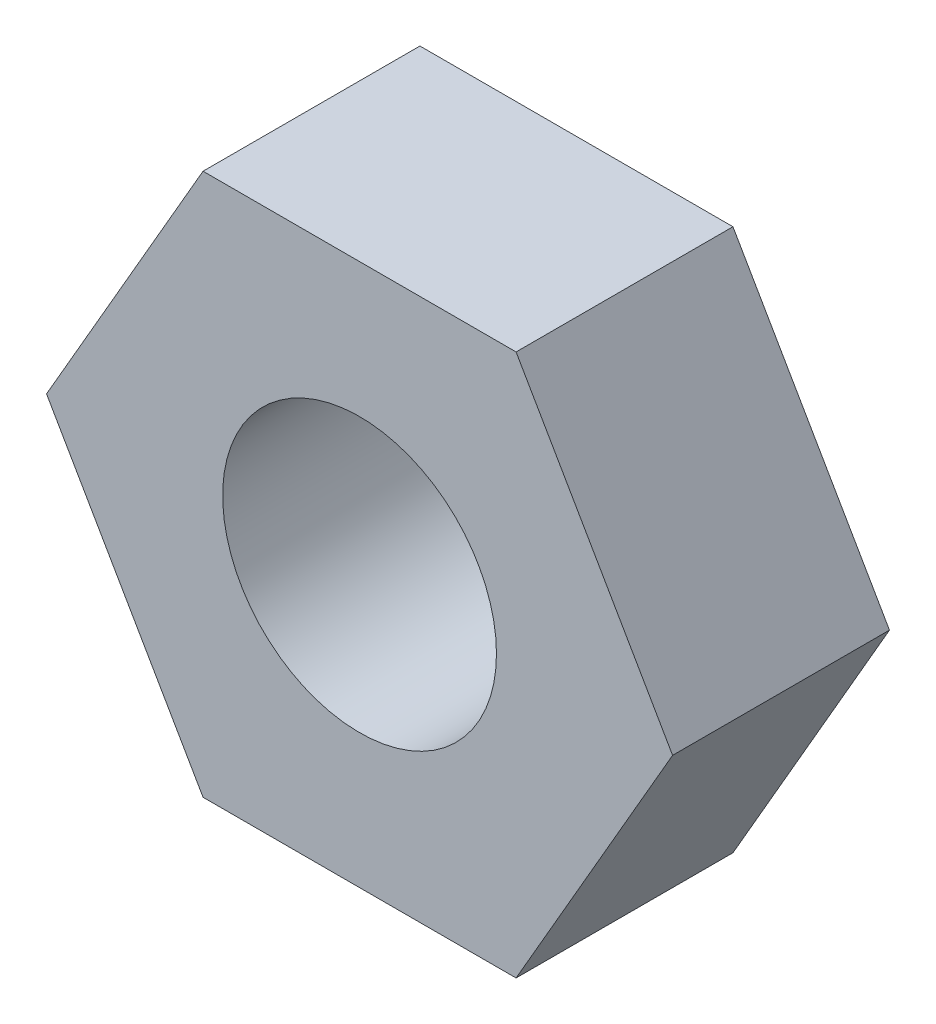
ISO-10303-21;
HEADER;
FILE_DESCRIPTION(('STEP AP214'),'2;1');
FILE_NAME('part.step','',(''),(''),'','','');
FILE_SCHEMA(('AUTOMOTIVE_DESIGN { 1 0 10303 214 1 1 1 1 }'));
ENDSEC;
DATA;
#1=APPLICATION_CONTEXT('core data for automotive mechanical design processes');
#2=APPLICATION_PROTOCOL_DEFINITION('international standard','automotive_design',2000,#1);
#3=PRODUCT_CONTEXT('',#1,'mechanical');
#4=PRODUCT('Part','Part','',(#3));
#5=PRODUCT_RELATED_PRODUCT_CATEGORY('part','',(#4));
#6=PRODUCT_DEFINITION_FORMATION('','',#4);
#7=PRODUCT_DEFINITION_CONTEXT('part definition',#1,'design');
#8=PRODUCT_DEFINITION('design','',#6,#7);
#9=PRODUCT_DEFINITION_SHAPE('','',#8);
#10=(LENGTH_UNIT() NAMED_UNIT(*) SI_UNIT(.MILLI.,.METRE.));
#11=(NAMED_UNIT(*) PLANE_ANGLE_UNIT() SI_UNIT($,.RADIAN.));
#12=(NAMED_UNIT(*) SI_UNIT($,.STERADIAN.) SOLID_ANGLE_UNIT());
#13=UNCERTAINTY_MEASURE_WITH_UNIT(LENGTH_MEASURE(1.E-05),#10,'distance_accuracy_value','');
#14=(GEOMETRIC_REPRESENTATION_CONTEXT(3) GLOBAL_UNCERTAINTY_ASSIGNED_CONTEXT((#13)) GLOBAL_UNIT_ASSIGNED_CONTEXT((#10,
#11,#12)) REPRESENTATION_CONTEXT('',''));
#15=CARTESIAN_POINT('',(0.,0.,0.));
#16=DIRECTION('',(0.,0.,1.));
#17=DIRECTION('',(1.,0.,0.));
#18=AXIS2_PLACEMENT_3D('',#15,#16,#17);
#19=CARTESIAN_POINT('',(0.,0.,1.6));
#20=DIRECTION('',(0.,0.,1.));
#21=DIRECTION('',(1.,0.,0.));
#22=AXIS2_PLACEMENT_3D('',#19,#20,#21);
#23=PLANE('',#22);
#24=DIRECTION('',(0.5,0.866025403784439,0.));
#25=VECTOR('',#24,1.);
#26=CARTESIAN_POINT('',(1.15470053837925,-2.,1.6));
#27=LINE('',#26,#25);
#28=CARTESIAN_POINT('',(1.15470053837925,-2.,1.6));
#29=VERTEX_POINT('',#28);
#30=CARTESIAN_POINT('',(2.3094010767585,0.,1.6));
#31=VERTEX_POINT('',#30);
#32=EDGE_CURVE('E141',#29,#31,#27,.T.);
#33=ORIENTED_EDGE('',*,*,#32,.T.);
#34=DIRECTION('',(-0.5,0.866025403784439,0.));
#35=VECTOR('',#34,1.);
#36=CARTESIAN_POINT('',(2.3094010767585,0.,1.6));
#37=LINE('',#36,#35);
#38=CARTESIAN_POINT('',(1.15470053837925,2.,1.6));
#39=VERTEX_POINT('',#38);
#40=EDGE_CURVE('E101',#31,#39,#37,.T.);
#41=ORIENTED_EDGE('',*,*,#40,.T.);
#42=DIRECTION('',(-1.,0.,0.));
#43=VECTOR('',#42,1.);
#44=CARTESIAN_POINT('',(1.15470053837925,2.,1.6));
#45=LINE('',#44,#43);
#46=CARTESIAN_POINT('',(-1.15470053837925,2.,1.6));
#47=VERTEX_POINT('',#46);
#48=EDGE_CURVE('E111',#39,#47,#45,.T.);
#49=ORIENTED_EDGE('',*,*,#48,.T.);
#50=DIRECTION('',(-0.5,-0.866025403784439,0.));
#51=VECTOR('',#50,1.);
#52=CARTESIAN_POINT('',(-1.15470053837925,2.,1.6));
#53=LINE('',#52,#51);
#54=CARTESIAN_POINT('',(-2.3094010767585,0.,1.6));
#55=VERTEX_POINT('',#54);
#56=EDGE_CURVE('E107',#47,#55,#53,.T.);
#57=ORIENTED_EDGE('',*,*,#56,.T.);
#58=DIRECTION('',(0.5,-0.866025403784439,0.));
#59=VECTOR('',#58,1.);
#60=CARTESIAN_POINT('',(-2.3094010767585,0.,1.6));
#61=LINE('',#60,#59);
#62=CARTESIAN_POINT('',(-1.15470053837925,-2.,1.6));
#63=VERTEX_POINT('',#62);
#64=EDGE_CURVE('E115',#55,#63,#61,.T.);
#65=ORIENTED_EDGE('',*,*,#64,.T.);
#66=DIRECTION('',(1.,0.,0.));
#67=VECTOR('',#66,1.);
#68=CARTESIAN_POINT('',(-1.15470053837925,-2.,1.6));
#69=LINE('',#68,#67);
#70=EDGE_CURVE('E65',#63,#29,#69,.T.);
#71=ORIENTED_EDGE('',*,*,#70,.T.);
#72=EDGE_LOOP('',(#33,#41,#49,#57,#65,#71));
#73=FACE_BOUND('',#72,.T.);
#74=CARTESIAN_POINT('',(0.,0.,1.6));
#75=DIRECTION('',(0.,0.,1.));
#76=DIRECTION('',(1.,0.,0.));
#77=AXIS2_PLACEMENT_3D('',#74,#75,#76);
#78=CIRCLE('',#77,1.01);
#79=CARTESIAN_POINT('',(1.01,0.,1.6));
#80=VERTEX_POINT('',#79);
#81=EDGE_CURVE('E136',#80,#80,#78,.T.);
#82=ORIENTED_EDGE('',*,*,#81,.F.);
#83=EDGE_LOOP('',(#82));
#84=FACE_BOUND('',#83,.T.);
#85=ADVANCED_FACE('F50',(#73,#84),#23,.T.);
#86=CARTESIAN_POINT('',(0.,0.,0.));
#87=DIRECTION('',(0.,0.,1.));
#88=DIRECTION('',(1.,0.,0.));
#89=AXIS2_PLACEMENT_3D('',#86,#87,#88);
#90=PLANE('',#89);
#91=DIRECTION('',(0.5,0.866025403784439,0.));
#92=VECTOR('',#91,1.);
#93=CARTESIAN_POINT('',(1.15470053837925,-2.,0.));
#94=LINE('',#93,#92);
#95=CARTESIAN_POINT('',(1.15470053837925,-2.,0.));
#96=VERTEX_POINT('',#95);
#97=CARTESIAN_POINT('',(2.3094010767585,0.,0.));
#98=VERTEX_POINT('',#97);
#99=EDGE_CURVE('E134',#96,#98,#94,.T.);
#100=ORIENTED_EDGE('',*,*,#99,.F.);
#101=DIRECTION('',(1.,0.,0.));
#102=VECTOR('',#101,1.);
#103=CARTESIAN_POINT('',(-1.15470053837925,-2.,0.));
#104=LINE('',#103,#102);
#105=CARTESIAN_POINT('',(-1.15470053837925,-2.,0.));
#106=VERTEX_POINT('',#105);
#107=EDGE_CURVE('E91',#106,#96,#104,.T.);
#108=ORIENTED_EDGE('',*,*,#107,.F.);
#109=DIRECTION('',(0.5,-0.866025403784439,0.));
#110=VECTOR('',#109,1.);
#111=CARTESIAN_POINT('',(-2.3094010767585,0.,0.));
#112=LINE('',#111,#110);
#113=CARTESIAN_POINT('',(-2.3094010767585,0.,0.));
#114=VERTEX_POINT('',#113);
#115=EDGE_CURVE('E87',#114,#106,#112,.T.);
#116=ORIENTED_EDGE('',*,*,#115,.F.);
#117=DIRECTION('',(-0.5,-0.866025403784439,0.));
#118=VECTOR('',#117,1.);
#119=CARTESIAN_POINT('',(-1.15470053837925,2.,0.));
#120=LINE('',#119,#118);
#121=CARTESIAN_POINT('',(-1.15470053837925,2.,0.));
#122=VERTEX_POINT('',#121);
#123=EDGE_CURVE('E125',#122,#114,#120,.T.);
#124=ORIENTED_EDGE('',*,*,#123,.F.);
#125=DIRECTION('',(-1.,0.,0.));
#126=VECTOR('',#125,1.);
#127=CARTESIAN_POINT('',(1.15470053837925,2.,0.));
#128=LINE('',#127,#126);
#129=CARTESIAN_POINT('',(1.15470053837925,2.,0.));
#130=VERTEX_POINT('',#129);
#131=EDGE_CURVE('E137',#130,#122,#128,.T.);
#132=ORIENTED_EDGE('',*,*,#131,.F.);
#133=DIRECTION('',(-0.5,0.866025403784439,0.));
#134=VECTOR('',#133,1.);
#135=CARTESIAN_POINT('',(2.3094010767585,0.,0.));
#136=LINE('',#135,#134);
#137=EDGE_CURVE('E131',#98,#130,#136,.T.);
#138=ORIENTED_EDGE('',*,*,#137,.F.);
#139=EDGE_LOOP('',(#100,#108,#116,#124,#132,#138));
#140=FACE_BOUND('',#139,.T.);
#141=CARTESIAN_POINT('',(0.,0.,0.));
#142=DIRECTION('',(0.,0.,1.));
#143=DIRECTION('',(1.,0.,0.));
#144=AXIS2_PLACEMENT_3D('',#141,#142,#143);
#145=CIRCLE('',#144,1.01);
#146=CARTESIAN_POINT('',(1.01,0.,0.));
#147=VERTEX_POINT('',#146);
#148=EDGE_CURVE('E289',#147,#147,#145,.T.);
#149=ORIENTED_EDGE('',*,*,#148,.T.);
#150=EDGE_LOOP('',(#149));
#151=FACE_BOUND('',#150,.T.);
#152=ADVANCED_FACE('F155',(#140,#151),#90,.F.);
#153=CARTESIAN_POINT('',(1.15470053837925,-2.,1.6));
#154=DIRECTION('',(-0.866025403784439,0.5,0.));
#155=DIRECTION('',(-0.5,-0.866025403784439,0.));
#156=AXIS2_PLACEMENT_3D('',#153,#154,#155);
#157=PLANE('',#156);
#158=ORIENTED_EDGE('',*,*,#99,.T.);
#159=DIRECTION('',(0.,0.,-1.));
#160=VECTOR('',#159,1.);
#161=CARTESIAN_POINT('',(2.3094010767585,0.,1.6));
#162=LINE('',#161,#160);
#163=EDGE_CURVE('E11',#31,#98,#162,.T.);
#164=ORIENTED_EDGE('',*,*,#163,.F.);
#165=ORIENTED_EDGE('',*,*,#32,.F.);
#166=DIRECTION('',(0.,0.,-1.));
#167=VECTOR('',#166,1.);
#168=CARTESIAN_POINT('',(1.15470053837925,-2.,1.6));
#169=LINE('',#168,#167);
#170=EDGE_CURVE('E126',#29,#96,#169,.T.);
#171=ORIENTED_EDGE('',*,*,#170,.T.);
#172=EDGE_LOOP('',(#158,#164,#165,#171));
#173=FACE_BOUND('',#172,.T.);
#174=ADVANCED_FACE('F47',(#173),#157,.F.);
#175=CARTESIAN_POINT('',(2.3094010767585,0.,1.6));
#176=DIRECTION('',(-0.866025403784439,-0.5,0.));
#177=DIRECTION('',(0.5,-0.866025403784439,0.));
#178=AXIS2_PLACEMENT_3D('',#175,#176,#177);
#179=PLANE('',#178);
#180=ORIENTED_EDGE('',*,*,#137,.T.);
#181=DIRECTION('',(0.,0.,-1.));
#182=VECTOR('',#181,1.);
#183=CARTESIAN_POINT('',(1.15470053837925,2.,1.6));
#184=LINE('',#183,#182);
#185=EDGE_CURVE('E57',#39,#130,#184,.T.);
#186=ORIENTED_EDGE('',*,*,#185,.F.);
#187=ORIENTED_EDGE('',*,*,#40,.F.);
#188=ORIENTED_EDGE('',*,*,#163,.T.);
#189=EDGE_LOOP('',(#180,#186,#187,#188));
#190=FACE_BOUND('',#189,.T.);
#191=ADVANCED_FACE('F180',(#190),#179,.F.);
#192=CARTESIAN_POINT('',(1.15470053837925,2.,1.6));
#193=DIRECTION('',(0.,-1.,0.));
#194=DIRECTION('',(1.,0.,0.));
#195=AXIS2_PLACEMENT_3D('',#192,#193,#194);
#196=PLANE('',#195);
#197=ORIENTED_EDGE('',*,*,#131,.T.);
#198=DIRECTION('',(0.,0.,-1.));
#199=VECTOR('',#198,1.);
#200=CARTESIAN_POINT('',(-1.15470053837925,2.,1.6));
#201=LINE('',#200,#199);
#202=EDGE_CURVE('E122',#47,#122,#201,.T.);
#203=ORIENTED_EDGE('',*,*,#202,.F.);
#204=ORIENTED_EDGE('',*,*,#48,.F.);
#205=ORIENTED_EDGE('',*,*,#185,.T.);
#206=EDGE_LOOP('',(#197,#203,#204,#205));
#207=FACE_BOUND('',#206,.T.);
#208=ADVANCED_FACE('F149',(#207),#196,.F.);
#209=CARTESIAN_POINT('',(-1.15470053837925,2.,1.6));
#210=DIRECTION('',(0.866025403784439,-0.5,0.));
#211=DIRECTION('',(0.5,0.866025403784439,0.));
#212=AXIS2_PLACEMENT_3D('',#209,#210,#211);
#213=PLANE('',#212);
#214=ORIENTED_EDGE('',*,*,#123,.T.);
#215=DIRECTION('',(0.,0.,-1.));
#216=VECTOR('',#215,1.);
#217=CARTESIAN_POINT('',(-2.3094010767585,0.,1.6));
#218=LINE('',#217,#216);
#219=EDGE_CURVE('E120',#55,#114,#218,.T.);
#220=ORIENTED_EDGE('',*,*,#219,.F.);
#221=ORIENTED_EDGE('',*,*,#56,.F.);
#222=ORIENTED_EDGE('',*,*,#202,.T.);
#223=EDGE_LOOP('',(#214,#220,#221,#222));
#224=FACE_BOUND('',#223,.T.);
#225=ADVANCED_FACE('F116',(#224),#213,.F.);
#226=CARTESIAN_POINT('',(-2.3094010767585,0.,1.6));
#227=DIRECTION('',(0.866025403784439,0.5,0.));
#228=DIRECTION('',(-0.5,0.866025403784439,0.));
#229=AXIS2_PLACEMENT_3D('',#226,#227,#228);
#230=PLANE('',#229);
#231=ORIENTED_EDGE('',*,*,#115,.T.);
#232=DIRECTION('',(0.,0.,-1.));
#233=VECTOR('',#232,1.);
#234=CARTESIAN_POINT('',(-1.15470053837925,-2.,1.6));
#235=LINE('',#234,#233);
#236=EDGE_CURVE('E123',#63,#106,#235,.T.);
#237=ORIENTED_EDGE('',*,*,#236,.F.);
#238=ORIENTED_EDGE('',*,*,#64,.F.);
#239=ORIENTED_EDGE('',*,*,#219,.T.);
#240=EDGE_LOOP('',(#231,#237,#238,#239));
#241=FACE_BOUND('',#240,.T.);
#242=ADVANCED_FACE('F127',(#241),#230,.F.);
#243=CARTESIAN_POINT('',(-1.15470053837925,-2.,1.6));
#244=DIRECTION('',(0.,1.,0.));
#245=DIRECTION('',(-1.,0.,0.));
#246=AXIS2_PLACEMENT_3D('',#243,#244,#245);
#247=PLANE('',#246);
#248=ORIENTED_EDGE('',*,*,#107,.T.);
#249=ORIENTED_EDGE('',*,*,#170,.F.);
#250=ORIENTED_EDGE('',*,*,#70,.F.);
#251=ORIENTED_EDGE('',*,*,#236,.T.);
#252=EDGE_LOOP('',(#248,#249,#250,#251));
#253=FACE_BOUND('',#252,.T.);
#254=ADVANCED_FACE('F160',(#253),#247,.F.);
#255=CARTESIAN_POINT('',(0.,0.,1.6));
#256=DIRECTION('',(0.,0.,-1.));
#257=DIRECTION('',(-1.,0.,0.));
#258=AXIS2_PLACEMENT_3D('',#255,#256,#257);
#259=CYLINDRICAL_SURFACE('',#258,1.01);
#260=ORIENTED_EDGE('',*,*,#81,.T.);
#261=EDGE_LOOP('',(#260));
#262=FACE_BOUND('',#261,.T.);
#263=ORIENTED_EDGE('',*,*,#148,.F.);
#264=EDGE_LOOP('',(#263));
#265=FACE_BOUND('',#264,.T.);
#266=ADVANCED_FACE('F157',(#262,#265),#259,.F.);
#267=CLOSED_SHELL('',(#85,#152,#174,#191,#208,#225,#242,#254,#266));
#268=MANIFOLD_SOLID_BREP('B2',#267);
#269=ADVANCED_BREP_SHAPE_REPRESENTATION('',(#18,#268),#14);
#270=SHAPE_DEFINITION_REPRESENTATION(#9,#269);
ENDSEC;
END-ISO-10303-21;
